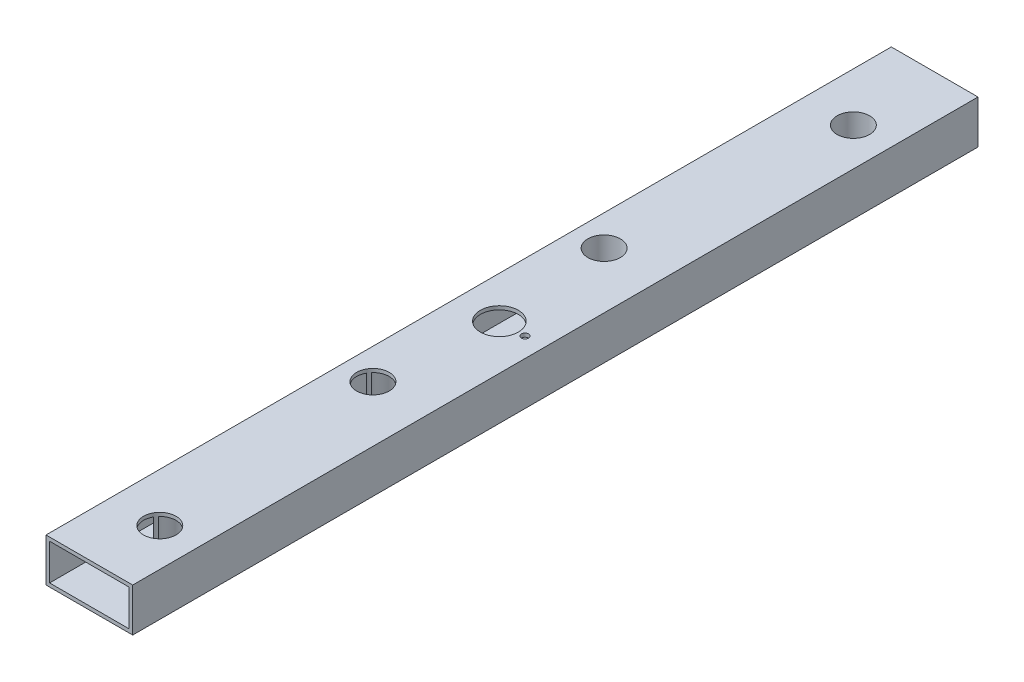
ISO-10303-21;
HEADER;
FILE_DESCRIPTION(('STEP AP214'),'2;1');
FILE_NAME('part.step','',(''),(''),'','','');
FILE_SCHEMA(('AUTOMOTIVE_DESIGN { 1 0 10303 214 1 1 1 1 }'));
ENDSEC;
DATA;
#1=APPLICATION_CONTEXT('core data for automotive mechanical design processes');
#2=APPLICATION_PROTOCOL_DEFINITION('international standard','automotive_design',2000,#1);
#3=PRODUCT_CONTEXT('',#1,'mechanical');
#4=PRODUCT('Part','Part','',(#3));
#5=PRODUCT_RELATED_PRODUCT_CATEGORY('part','',(#4));
#6=PRODUCT_DEFINITION_FORMATION('','',#4);
#7=PRODUCT_DEFINITION_CONTEXT('part definition',#1,'design');
#8=PRODUCT_DEFINITION('design','',#6,#7);
#9=PRODUCT_DEFINITION_SHAPE('','',#8);
#10=(LENGTH_UNIT() NAMED_UNIT(*) SI_UNIT(.MILLI.,.METRE.));
#11=(NAMED_UNIT(*) PLANE_ANGLE_UNIT() SI_UNIT($,.RADIAN.));
#12=(NAMED_UNIT(*) SI_UNIT($,.STERADIAN.) SOLID_ANGLE_UNIT());
#13=UNCERTAINTY_MEASURE_WITH_UNIT(LENGTH_MEASURE(1.E-05),#10,'distance_accuracy_value','');
#14=(GEOMETRIC_REPRESENTATION_CONTEXT(3) GLOBAL_UNCERTAINTY_ASSIGNED_CONTEXT((#13)) GLOBAL_UNIT_ASSIGNED_CONTEXT((#10,
#11,#12)) REPRESENTATION_CONTEXT('',''));
#15=CARTESIAN_POINT('',(0.,0.,0.));
#16=DIRECTION('',(0.,0.,1.));
#17=DIRECTION('',(1.,0.,0.));
#18=AXIS2_PLACEMENT_3D('',#15,#16,#17);
#19=CARTESIAN_POINT('',(59.055,0.,381.));
#20=DIRECTION('',(0.,1.,0.));
#21=DIRECTION('',(0.,0.,1.));
#22=AXIS2_PLACEMENT_3D('',#19,#20,#21);
#23=CYLINDRICAL_SURFACE('',#22,3.17499999999998);
#24=CARTESIAN_POINT('',(59.055,34.925,381.));
#25=DIRECTION('',(0.,1.,0.));
#26=DIRECTION('',(0.,0.,1.));
#27=AXIS2_PLACEMENT_3D('',#24,#25,#26);
#28=CIRCLE('',#27,3.17499999999998);
#29=CARTESIAN_POINT('',(59.055,34.925,384.175));
#30=VERTEX_POINT('',#29);
#31=EDGE_CURVE('E239',#30,#30,#28,.T.);
#32=ORIENTED_EDGE('',*,*,#31,.F.);
#33=EDGE_LOOP('',(#32));
#34=FACE_BOUND('',#33,.T.);
#35=CARTESIAN_POINT('',(59.055,38.1,381.));
#36=DIRECTION('',(0.,1.,0.));
#37=DIRECTION('',(0.,0.,1.));
#38=AXIS2_PLACEMENT_3D('',#35,#36,#37);
#39=CIRCLE('',#38,3.17499999999998);
#40=CARTESIAN_POINT('',(59.055,38.1,384.175));
#41=VERTEX_POINT('',#40);
#42=EDGE_CURVE('E248',#41,#41,#39,.T.);
#43=ORIENTED_EDGE('',*,*,#42,.T.);
#44=EDGE_LOOP('',(#43));
#45=FACE_BOUND('',#44,.T.);
#46=ADVANCED_FACE('F16',(#34,#45),#23,.F.);
#47=CARTESIAN_POINT('',(36.5125,0.,381.));
#48=DIRECTION('',(0.,1.,0.));
#49=DIRECTION('',(0.,0.,1.));
#50=AXIS2_PLACEMENT_3D('',#47,#48,#49);
#51=CYLINDRICAL_SURFACE('',#50,16.66875);
#52=CARTESIAN_POINT('',(36.5125,34.925,381.));
#53=DIRECTION('',(0.,1.,0.));
#54=DIRECTION('',(0.,0.,1.));
#55=AXIS2_PLACEMENT_3D('',#52,#53,#54);
#56=CIRCLE('',#55,16.66875);
#57=CARTESIAN_POINT('',(36.5125,34.925,397.66875));
#58=VERTEX_POINT('',#57);
#59=EDGE_CURVE('E230',#58,#58,#56,.T.);
#60=ORIENTED_EDGE('',*,*,#59,.F.);
#61=EDGE_LOOP('',(#60));
#62=FACE_BOUND('',#61,.T.);
#63=CARTESIAN_POINT('',(36.5125,38.1,381.));
#64=DIRECTION('',(0.,1.,0.));
#65=DIRECTION('',(0.,0.,1.));
#66=AXIS2_PLACEMENT_3D('',#63,#64,#65);
#67=CIRCLE('',#66,16.66875);
#68=CARTESIAN_POINT('',(36.5125,38.1,397.66875));
#69=VERTEX_POINT('',#68);
#70=EDGE_CURVE('E245',#69,#69,#67,.T.);
#71=ORIENTED_EDGE('',*,*,#70,.T.);
#72=EDGE_LOOP('',(#71));
#73=FACE_BOUND('',#72,.T.);
#74=ADVANCED_FACE('F379',(#62,#73),#51,.F.);
#75=CARTESIAN_POINT('',(26.9875,84.3164086658803,279.4));
#76=DIRECTION('',(0.,-1.,0.));
#77=DIRECTION('',(0.,0.,-1.));
#78=AXIS2_PLACEMENT_3D('',#75,#76,#77);
#79=CYLINDRICAL_SURFACE('',#78,17.4625);
#80=CARTESIAN_POINT('',(26.9875,3.175,279.4));
#81=DIRECTION('',(0.,-1.,0.));
#82=DIRECTION('',(0.,0.,-1.));
#83=AXIS2_PLACEMENT_3D('',#80,#81,#82);
#84=CIRCLE('',#83,17.4625);
#85=CARTESIAN_POINT('',(26.9875,3.175,261.9375));
#86=VERTEX_POINT('',#85);
#87=EDGE_CURVE('E223',#86,#86,#84,.T.);
#88=ORIENTED_EDGE('',*,*,#87,.F.);
#89=EDGE_LOOP('',(#88));
#90=FACE_BOUND('',#89,.T.);
#91=CARTESIAN_POINT('',(26.9875,34.925,279.4));
#92=DIRECTION('',(0.,-1.,0.));
#93=DIRECTION('',(0.,0.,-1.));
#94=AXIS2_PLACEMENT_3D('',#91,#92,#93);
#95=CIRCLE('',#94,17.4625);
#96=CARTESIAN_POINT('',(26.9875,34.925,261.9375));
#97=VERTEX_POINT('',#96);
#98=EDGE_CURVE('E242',#97,#97,#95,.F.);
#99=ORIENTED_EDGE('',*,*,#98,.F.);
#100=EDGE_LOOP('',(#99));
#101=FACE_BOUND('',#100,.T.);
#102=ADVANCED_FACE('F376',(#90,#101),#79,.T.);
#103=CARTESIAN_POINT('',(42.8625,84.3164086658803,76.2));
#104=DIRECTION('',(0.,-1.,0.));
#105=DIRECTION('',(0.,0.,-1.));
#106=AXIS2_PLACEMENT_3D('',#103,#104,#105);
#107=CYLINDRICAL_SURFACE('',#106,17.4625);
#108=CARTESIAN_POINT('',(42.8625,3.175,76.2));
#109=DIRECTION('',(0.,-1.,0.));
#110=DIRECTION('',(0.,0.,-1.));
#111=AXIS2_PLACEMENT_3D('',#108,#109,#110);
#112=CIRCLE('',#111,17.4625);
#113=CARTESIAN_POINT('',(42.8625,3.175,58.7375));
#114=VERTEX_POINT('',#113);
#115=EDGE_CURVE('E214',#114,#114,#112,.T.);
#116=ORIENTED_EDGE('',*,*,#115,.F.);
#117=EDGE_LOOP('',(#116));
#118=FACE_BOUND('',#117,.T.);
#119=CARTESIAN_POINT('',(42.8625,34.925,76.2));
#120=DIRECTION('',(0.,-1.,0.));
#121=DIRECTION('',(0.,0.,-1.));
#122=AXIS2_PLACEMENT_3D('',#119,#120,#121);
#123=CIRCLE('',#122,17.4625);
#124=CARTESIAN_POINT('',(42.8625,34.925,58.7375));
#125=VERTEX_POINT('',#124);
#126=EDGE_CURVE('E227',#125,#125,#123,.F.);
#127=ORIENTED_EDGE('',*,*,#126,.F.);
#128=EDGE_LOOP('',(#127));
#129=FACE_BOUND('',#128,.T.);
#130=ADVANCED_FACE('F378',(#118,#129),#107,.T.);
#131=CARTESIAN_POINT('',(3.175,3.175,742.95));
#132=DIRECTION('',(0.,1.,0.));
#133=DIRECTION('',(0.,0.,1.));
#134=AXIS2_PLACEMENT_3D('',#131,#132,#133);
#135=PLANE('',#134);
#136=CARTESIAN_POINT('',(42.8625,3.175,666.75));
#137=DIRECTION('',(0.,-1.,0.));
#138=DIRECTION('',(0.,0.,-1.));
#139=AXIS2_PLACEMENT_3D('',#136,#137,#138);
#140=CIRCLE('',#139,14.2875);
#141=CARTESIAN_POINT('',(53.5117737428428,3.175,676.275));
#142=VERTEX_POINT('',#141);
#143=CARTESIAN_POINT('',(32.2132262571573,3.175,676.275));
#144=VERTEX_POINT('',#143);
#145=EDGE_CURVE('E19',#142,#144,#140,.F.);
#146=ORIENTED_EDGE('',*,*,#145,.T.);
#147=CARTESIAN_POINT('',(42.8625,3.175,685.8));
#148=DIRECTION('',(0.,1.,0.));
#149=DIRECTION('',(0.,0.,1.));
#150=AXIS2_PLACEMENT_3D('',#147,#148,#149);
#151=CIRCLE('',#150,14.2875);
#152=EDGE_CURVE('E131',#144,#142,#151,.F.);
#153=ORIENTED_EDGE('',*,*,#152,.T.);
#154=EDGE_LOOP('',(#146,#153));
#155=FACE_BOUND('',#154,.T.);
#156=ADVANCED_FACE('F130',(#155),#135,.T.);
#157=CARTESIAN_POINT('',(42.8625,84.3164086658803,666.75));
#158=DIRECTION('',(0.,-1.,0.));
#159=DIRECTION('',(0.,0.,-1.));
#160=AXIS2_PLACEMENT_3D('',#157,#158,#159);
#161=CYLINDRICAL_SURFACE('',#160,14.2875);
#162=CARTESIAN_POINT('',(42.8625,34.925,666.75));
#163=DIRECTION('',(0.,-1.,0.));
#164=DIRECTION('',(0.,0.,-1.));
#165=AXIS2_PLACEMENT_3D('',#162,#163,#164);
#166=CIRCLE('',#165,14.2875);
#167=CARTESIAN_POINT('',(32.2132262571573,34.925,676.275));
#168=VERTEX_POINT('',#167);
#169=CARTESIAN_POINT('',(53.5117737428428,34.925,676.275));
#170=VERTEX_POINT('',#169);
#171=EDGE_CURVE('E132',#168,#170,#166,.T.);
#172=ORIENTED_EDGE('',*,*,#171,.F.);
#173=DIRECTION('',(0.,1.,0.));
#174=VECTOR('',#173,1.);
#175=CARTESIAN_POINT('',(32.2132262571573,0.,676.275));
#176=LINE('',#175,#174);
#177=EDGE_CURVE('E137',#168,#144,#176,.F.);
#178=ORIENTED_EDGE('',*,*,#177,.T.);
#179=ORIENTED_EDGE('',*,*,#145,.F.);
#180=DIRECTION('',(0.,1.,0.));
#181=VECTOR('',#180,1.);
#182=CARTESIAN_POINT('',(53.5117737428428,0.,676.275));
#183=LINE('',#182,#181);
#184=EDGE_CURVE('E138',#142,#170,#183,.T.);
#185=ORIENTED_EDGE('',*,*,#184,.T.);
#186=EDGE_LOOP('',(#172,#178,#179,#185));
#187=FACE_BOUND('',#186,.T.);
#188=ADVANCED_FACE('F140',(#187),#161,.F.);
#189=CARTESIAN_POINT('',(3.175,34.925,742.95));
#190=DIRECTION('',(0.,-1.,0.));
#191=DIRECTION('',(0.,0.,-1.));
#192=AXIS2_PLACEMENT_3D('',#189,#190,#191);
#193=PLANE('',#192);
#194=CARTESIAN_POINT('',(42.8625,34.925,685.8));
#195=DIRECTION('',(0.,1.,0.));
#196=DIRECTION('',(0.,0.,1.));
#197=AXIS2_PLACEMENT_3D('',#194,#195,#196);
#198=CIRCLE('',#197,14.2875);
#199=EDGE_CURVE('E209',#170,#168,#198,.T.);
#200=ORIENTED_EDGE('',*,*,#199,.T.);
#201=ORIENTED_EDGE('',*,*,#171,.T.);
#202=EDGE_LOOP('',(#200,#201));
#203=FACE_BOUND('',#202,.T.);
#204=ADVANCED_FACE('F255',(#203),#193,.T.);
#205=CARTESIAN_POINT('',(42.8625,84.3164086658803,666.75));
#206=DIRECTION('',(0.,-1.,0.));
#207=DIRECTION('',(0.,0.,-1.));
#208=AXIS2_PLACEMENT_3D('',#205,#206,#207);
#209=CYLINDRICAL_SURFACE('',#208,17.4625);
#210=DIRECTION('',(0.,1.,0.));
#211=VECTOR('',#210,1.);
#212=CARTESIAN_POINT('',(55.3848688742276,0.,678.920833333333));
#213=LINE('',#212,#211);
#214=CARTESIAN_POINT('',(55.3848688742276,34.925,678.920833333333));
#215=VERTEX_POINT('',#214);
#216=CARTESIAN_POINT('',(55.3848688742276,3.175,678.920833333333));
#217=VERTEX_POINT('',#216);
#218=EDGE_CURVE('E202',#215,#217,#213,.F.);
#219=ORIENTED_EDGE('',*,*,#218,.T.);
#220=CARTESIAN_POINT('',(42.8625,3.175,666.75));
#221=DIRECTION('',(0.,-1.,0.));
#222=DIRECTION('',(0.,0.,-1.));
#223=AXIS2_PLACEMENT_3D('',#220,#221,#222);
#224=CIRCLE('',#223,17.4625);
#225=CARTESIAN_POINT('',(30.3401311257725,3.175,678.920833333333));
#226=VERTEX_POINT('',#225);
#227=EDGE_CURVE('E221',#226,#217,#224,.T.);
#228=ORIENTED_EDGE('',*,*,#227,.F.);
#229=DIRECTION('',(0.,1.,0.));
#230=VECTOR('',#229,1.);
#231=CARTESIAN_POINT('',(30.3401311257725,0.,678.920833333333));
#232=LINE('',#231,#230);
#233=CARTESIAN_POINT('',(30.3401311257725,34.925,678.920833333333));
#234=VERTEX_POINT('',#233);
#235=EDGE_CURVE('E142',#226,#234,#232,.T.);
#236=ORIENTED_EDGE('',*,*,#235,.T.);
#237=CARTESIAN_POINT('',(42.8625,34.925,666.75));
#238=DIRECTION('',(0.,-1.,0.));
#239=DIRECTION('',(0.,0.,-1.));
#240=AXIS2_PLACEMENT_3D('',#237,#238,#239);
#241=CIRCLE('',#240,17.4625);
#242=EDGE_CURVE('E236',#215,#234,#241,.F.);
#243=ORIENTED_EDGE('',*,*,#242,.F.);
#244=EDGE_LOOP('',(#219,#228,#236,#243));
#245=FACE_BOUND('',#244,.T.);
#246=ADVANCED_FACE('F257',(#245),#209,.T.);
#247=CARTESIAN_POINT('',(3.175,3.175,742.95));
#248=DIRECTION('',(0.,1.,0.));
#249=DIRECTION('',(0.,0.,1.));
#250=AXIS2_PLACEMENT_3D('',#247,#248,#249);
#251=PLANE('',#250);
#252=CARTESIAN_POINT('',(26.9875,3.175,463.55));
#253=DIRECTION('',(0.,-1.,0.));
#254=DIRECTION('',(0.,0.,-1.));
#255=AXIS2_PLACEMENT_3D('',#252,#253,#254);
#256=CIRCLE('',#255,14.2875);
#257=CARTESIAN_POINT('',(37.6367737428428,3.175,473.075));
#258=VERTEX_POINT('',#257);
#259=CARTESIAN_POINT('',(16.3382262571573,3.175,473.075));
#260=VERTEX_POINT('',#259);
#261=EDGE_CURVE('E253',#258,#260,#256,.F.);
#262=ORIENTED_EDGE('',*,*,#261,.T.);
#263=CARTESIAN_POINT('',(26.9875,3.175,482.6));
#264=DIRECTION('',(0.,1.,0.));
#265=DIRECTION('',(0.,0.,1.));
#266=AXIS2_PLACEMENT_3D('',#263,#264,#265);
#267=CIRCLE('',#266,14.2875);
#268=EDGE_CURVE('E194',#260,#258,#267,.F.);
#269=ORIENTED_EDGE('',*,*,#268,.T.);
#270=EDGE_LOOP('',(#262,#269));
#271=FACE_BOUND('',#270,.T.);
#272=ADVANCED_FACE('F264',(#271),#251,.T.);
#273=CARTESIAN_POINT('',(26.9875,84.3164086658803,463.55));
#274=DIRECTION('',(0.,-1.,0.));
#275=DIRECTION('',(0.,0.,-1.));
#276=AXIS2_PLACEMENT_3D('',#273,#274,#275);
#277=CYLINDRICAL_SURFACE('',#276,14.2875);
#278=CARTESIAN_POINT('',(26.9875,34.925,463.55));
#279=DIRECTION('',(0.,-1.,0.));
#280=DIRECTION('',(0.,0.,-1.));
#281=AXIS2_PLACEMENT_3D('',#278,#279,#280);
#282=CIRCLE('',#281,14.2875);
#283=CARTESIAN_POINT('',(16.3382262571573,34.925,473.075));
#284=VERTEX_POINT('',#283);
#285=CARTESIAN_POINT('',(37.6367737428428,34.925,473.075));
#286=VERTEX_POINT('',#285);
#287=EDGE_CURVE('E251',#284,#286,#282,.T.);
#288=ORIENTED_EDGE('',*,*,#287,.F.);
#289=DIRECTION('',(0.,1.,0.));
#290=VECTOR('',#289,1.);
#291=CARTESIAN_POINT('',(16.3382262571573,0.,473.075));
#292=LINE('',#291,#290);
#293=EDGE_CURVE('E197',#284,#260,#292,.F.);
#294=ORIENTED_EDGE('',*,*,#293,.T.);
#295=ORIENTED_EDGE('',*,*,#261,.F.);
#296=DIRECTION('',(0.,1.,0.));
#297=VECTOR('',#296,1.);
#298=CARTESIAN_POINT('',(37.6367737428428,0.,473.075));
#299=LINE('',#298,#297);
#300=EDGE_CURVE('E193',#258,#286,#299,.T.);
#301=ORIENTED_EDGE('',*,*,#300,.T.);
#302=EDGE_LOOP('',(#288,#294,#295,#301));
#303=FACE_BOUND('',#302,.T.);
#304=ADVANCED_FACE('F343',(#303),#277,.F.);
#305=CARTESIAN_POINT('',(3.175,34.925,742.95));
#306=DIRECTION('',(0.,-1.,0.));
#307=DIRECTION('',(0.,0.,-1.));
#308=AXIS2_PLACEMENT_3D('',#305,#306,#307);
#309=PLANE('',#308);
#310=CARTESIAN_POINT('',(26.9875,34.925,482.6));
#311=DIRECTION('',(0.,1.,0.));
#312=DIRECTION('',(0.,0.,1.));
#313=AXIS2_PLACEMENT_3D('',#310,#311,#312);
#314=CIRCLE('',#313,14.2875);
#315=EDGE_CURVE('E190',#286,#284,#314,.T.);
#316=ORIENTED_EDGE('',*,*,#315,.T.);
#317=ORIENTED_EDGE('',*,*,#287,.T.);
#318=EDGE_LOOP('',(#316,#317));
#319=FACE_BOUND('',#318,.T.);
#320=ADVANCED_FACE('F339',(#319),#309,.T.);
#321=CARTESIAN_POINT('',(26.9875,84.3164086658803,463.55));
#322=DIRECTION('',(0.,-1.,0.));
#323=DIRECTION('',(0.,0.,-1.));
#324=AXIS2_PLACEMENT_3D('',#321,#322,#323);
#325=CYLINDRICAL_SURFACE('',#324,17.4625);
#326=DIRECTION('',(0.,1.,0.));
#327=VECTOR('',#326,1.);
#328=CARTESIAN_POINT('',(39.5098688742276,0.,475.720833333333));
#329=LINE('',#328,#327);
#330=CARTESIAN_POINT('',(39.5098688742276,34.925,475.720833333333));
#331=VERTEX_POINT('',#330);
#332=CARTESIAN_POINT('',(39.5098688742276,3.175,475.720833333333));
#333=VERTEX_POINT('',#332);
#334=EDGE_CURVE('E183',#331,#333,#329,.F.);
#335=ORIENTED_EDGE('',*,*,#334,.T.);
#336=CARTESIAN_POINT('',(26.9875,3.175,463.55));
#337=DIRECTION('',(0.,-1.,0.));
#338=DIRECTION('',(0.,0.,-1.));
#339=AXIS2_PLACEMENT_3D('',#336,#337,#338);
#340=CIRCLE('',#339,17.4625);
#341=CARTESIAN_POINT('',(14.4651311257725,3.175,475.720833333333));
#342=VERTEX_POINT('',#341);
#343=EDGE_CURVE('E219',#342,#333,#340,.T.);
#344=ORIENTED_EDGE('',*,*,#343,.F.);
#345=DIRECTION('',(0.,1.,0.));
#346=VECTOR('',#345,1.);
#347=CARTESIAN_POINT('',(14.4651311257725,0.,475.720833333333));
#348=LINE('',#347,#346);
#349=CARTESIAN_POINT('',(14.4651311257725,34.925,475.720833333333));
#350=VERTEX_POINT('',#349);
#351=EDGE_CURVE('E201',#342,#350,#348,.T.);
#352=ORIENTED_EDGE('',*,*,#351,.T.);
#353=CARTESIAN_POINT('',(26.9875,34.925,463.55));
#354=DIRECTION('',(0.,-1.,0.));
#355=DIRECTION('',(0.,0.,-1.));
#356=AXIS2_PLACEMENT_3D('',#353,#354,#355);
#357=CIRCLE('',#356,17.4625);
#358=EDGE_CURVE('E233',#331,#350,#357,.F.);
#359=ORIENTED_EDGE('',*,*,#358,.F.);
#360=EDGE_LOOP('',(#335,#344,#352,#359));
#361=FACE_BOUND('',#360,.T.);
#362=ADVANCED_FACE('F335',(#361),#325,.T.);
#363=CARTESIAN_POINT('',(0.,38.1,742.95));
#364=DIRECTION('',(0.,-1.,0.));
#365=DIRECTION('',(0.,0.,-1.));
#366=AXIS2_PLACEMENT_3D('',#363,#364,#365);
#367=PLANE('',#366);
#368=DIRECTION('',(0.,0.,-1.));
#369=VECTOR('',#368,1.);
#370=CARTESIAN_POINT('',(0.,38.1,742.95));
#371=LINE('',#370,#369);
#372=CARTESIAN_POINT('',(0.,38.1,0.));
#373=VERTEX_POINT('',#372);
#374=CARTESIAN_POINT('',(0.,38.1,742.95));
#375=VERTEX_POINT('',#374);
#376=EDGE_CURVE('E173',#373,#375,#371,.F.);
#377=ORIENTED_EDGE('',*,*,#376,.T.);
#378=DIRECTION('',(-1.,0.,0.));
#379=VECTOR('',#378,1.);
#380=CARTESIAN_POINT('',(0.,38.1,742.95));
#381=LINE('',#380,#379);
#382=CARTESIAN_POINT('',(76.2,38.1,742.95));
#383=VERTEX_POINT('',#382);
#384=EDGE_CURVE('E603',#375,#383,#381,.F.);
#385=ORIENTED_EDGE('',*,*,#384,.T.);
#386=DIRECTION('',(0.,0.,1.));
#387=VECTOR('',#386,1.);
#388=CARTESIAN_POINT('',(76.2,38.1,742.95));
#389=LINE('',#388,#387);
#390=CARTESIAN_POINT('',(76.2,38.1,0.));
#391=VERTEX_POINT('',#390);
#392=EDGE_CURVE('E623',#383,#391,#389,.F.);
#393=ORIENTED_EDGE('',*,*,#392,.T.);
#394=DIRECTION('',(-1.,0.,0.));
#395=VECTOR('',#394,1.);
#396=CARTESIAN_POINT('',(0.,38.1,0.));
#397=LINE('',#396,#395);
#398=EDGE_CURVE('E629',#373,#391,#397,.F.);
#399=ORIENTED_EDGE('',*,*,#398,.F.);
#400=EDGE_LOOP('',(#377,#385,#393,#399));
#401=FACE_BOUND('',#400,.T.);
#402=CARTESIAN_POINT('',(42.8625,38.1,76.2));
#403=DIRECTION('',(0.,1.,0.));
#404=DIRECTION('',(0.,0.,1.));
#405=AXIS2_PLACEMENT_3D('',#402,#403,#404);
#406=CIRCLE('',#405,14.2875);
#407=CARTESIAN_POINT('',(42.8625,38.1,90.4875));
#408=VERTEX_POINT('',#407);
#409=EDGE_CURVE('E170',#408,#408,#406,.F.);
#410=ORIENTED_EDGE('',*,*,#409,.T.);
#411=EDGE_LOOP('',(#410));
#412=FACE_BOUND('',#411,.T.);
#413=CARTESIAN_POINT('',(26.9875,38.1,279.4));
#414=DIRECTION('',(0.,1.,0.));
#415=DIRECTION('',(0.,0.,1.));
#416=AXIS2_PLACEMENT_3D('',#413,#414,#415);
#417=CIRCLE('',#416,14.2875);
#418=CARTESIAN_POINT('',(26.9875,38.1,293.6875));
#419=VERTEX_POINT('',#418);
#420=EDGE_CURVE('E174',#419,#419,#417,.F.);
#421=ORIENTED_EDGE('',*,*,#420,.T.);
#422=EDGE_LOOP('',(#421));
#423=FACE_BOUND('',#422,.T.);
#424=ORIENTED_EDGE('',*,*,#70,.F.);
#425=EDGE_LOOP('',(#424));
#426=FACE_BOUND('',#425,.T.);
#427=CARTESIAN_POINT('',(26.9875,38.1,482.6));
#428=DIRECTION('',(0.,1.,0.));
#429=DIRECTION('',(0.,0.,1.));
#430=AXIS2_PLACEMENT_3D('',#427,#428,#429);
#431=CIRCLE('',#430,14.2875);
#432=CARTESIAN_POINT('',(26.9875,38.1,496.8875));
#433=VERTEX_POINT('',#432);
#434=EDGE_CURVE('E187',#433,#433,#431,.F.);
#435=ORIENTED_EDGE('',*,*,#434,.T.);
#436=EDGE_LOOP('',(#435));
#437=FACE_BOUND('',#436,.T.);
#438=CARTESIAN_POINT('',(42.8625,38.1,685.8));
#439=DIRECTION('',(0.,1.,0.));
#440=DIRECTION('',(0.,0.,1.));
#441=AXIS2_PLACEMENT_3D('',#438,#439,#440);
#442=CIRCLE('',#441,14.2875);
#443=CARTESIAN_POINT('',(42.8625,38.1,700.0875));
#444=VERTEX_POINT('',#443);
#445=EDGE_CURVE('E206',#444,#444,#442,.F.);
#446=ORIENTED_EDGE('',*,*,#445,.T.);
#447=EDGE_LOOP('',(#446));
#448=FACE_BOUND('',#447,.T.);
#449=ORIENTED_EDGE('',*,*,#42,.F.);
#450=EDGE_LOOP('',(#449));
#451=FACE_BOUND('',#450,.T.);
#452=ADVANCED_FACE('F331',(#401,#412,#423,#426,#437,#448,#451),#367,.F.);
#453=CARTESIAN_POINT('',(3.175,34.925,742.95));
#454=DIRECTION('',(0.,-1.,0.));
#455=DIRECTION('',(0.,0.,-1.));
#456=AXIS2_PLACEMENT_3D('',#453,#454,#455);
#457=PLANE('',#456);
#458=ORIENTED_EDGE('',*,*,#126,.T.);
#459=EDGE_LOOP('',(#458));
#460=FACE_BOUND('',#459,.T.);
#461=DIRECTION('',(-1.,0.,0.));
#462=VECTOR('',#461,1.);
#463=CARTESIAN_POINT('',(0.,34.925,742.95));
#464=LINE('',#463,#462);
#465=CARTESIAN_POINT('',(73.025,34.925,742.95));
#466=VERTEX_POINT('',#465);
#467=CARTESIAN_POINT('',(3.175,34.925,742.95));
#468=VERTEX_POINT('',#467);
#469=EDGE_CURVE('E614',#466,#468,#464,.T.);
#470=ORIENTED_EDGE('',*,*,#469,.T.);
#471=DIRECTION('',(0.,0.,-1.));
#472=VECTOR('',#471,1.);
#473=CARTESIAN_POINT('',(3.175,34.925,742.95));
#474=LINE('',#473,#472);
#475=CARTESIAN_POINT('',(3.175,34.925,0.));
#476=VERTEX_POINT('',#475);
#477=EDGE_CURVE('E226',#476,#468,#474,.F.);
#478=ORIENTED_EDGE('',*,*,#477,.F.);
#479=DIRECTION('',(-1.,0.,0.));
#480=VECTOR('',#479,1.);
#481=CARTESIAN_POINT('',(0.,34.925,0.));
#482=LINE('',#481,#480);
#483=CARTESIAN_POINT('',(73.025,34.925,0.));
#484=VERTEX_POINT('',#483);
#485=EDGE_CURVE('E632',#484,#476,#482,.T.);
#486=ORIENTED_EDGE('',*,*,#485,.F.);
#487=DIRECTION('',(0.,0.,1.));
#488=VECTOR('',#487,1.);
#489=CARTESIAN_POINT('',(73.025,34.925,742.95));
#490=LINE('',#489,#488);
#491=EDGE_CURVE('E213',#466,#484,#490,.F.);
#492=ORIENTED_EDGE('',*,*,#491,.F.);
#493=EDGE_LOOP('',(#470,#478,#486,#492));
#494=FACE_BOUND('',#493,.T.);
#495=ORIENTED_EDGE('',*,*,#59,.T.);
#496=EDGE_LOOP('',(#495));
#497=FACE_BOUND('',#496,.T.);
#498=ORIENTED_EDGE('',*,*,#358,.T.);
#499=CARTESIAN_POINT('',(26.9875,34.925,482.6));
#500=DIRECTION('',(0.,1.,0.));
#501=DIRECTION('',(0.,0.,1.));
#502=AXIS2_PLACEMENT_3D('',#499,#500,#501);
#503=CIRCLE('',#502,14.2875);
#504=EDGE_CURVE('E184',#350,#331,#503,.T.);
#505=ORIENTED_EDGE('',*,*,#504,.T.);
#506=EDGE_LOOP('',(#498,#505));
#507=FACE_BOUND('',#506,.T.);
#508=ORIENTED_EDGE('',*,*,#242,.T.);
#509=CARTESIAN_POINT('',(42.8625,34.925,685.8));
#510=DIRECTION('',(0.,1.,0.));
#511=DIRECTION('',(0.,0.,1.));
#512=AXIS2_PLACEMENT_3D('',#509,#510,#511);
#513=CIRCLE('',#512,14.2875);
#514=EDGE_CURVE('E203',#234,#215,#513,.T.);
#515=ORIENTED_EDGE('',*,*,#514,.T.);
#516=EDGE_LOOP('',(#508,#515));
#517=FACE_BOUND('',#516,.T.);
#518=ORIENTED_EDGE('',*,*,#31,.T.);
#519=EDGE_LOOP('',(#518));
#520=FACE_BOUND('',#519,.T.);
#521=ORIENTED_EDGE('',*,*,#98,.T.);
#522=EDGE_LOOP('',(#521));
#523=FACE_BOUND('',#522,.T.);
#524=ADVANCED_FACE('F327',(#460,#494,#497,#507,#517,#520,#523),#457,.T.);
#525=CARTESIAN_POINT('',(3.175,3.175,742.95));
#526=DIRECTION('',(1.,0.,0.));
#527=DIRECTION('',(0.,0.,-1.));
#528=AXIS2_PLACEMENT_3D('',#525,#526,#527);
#529=PLANE('',#528);
#530=DIRECTION('',(0.,1.,0.));
#531=VECTOR('',#530,1.);
#532=CARTESIAN_POINT('',(3.175,0.,742.95));
#533=LINE('',#532,#531);
#534=CARTESIAN_POINT('',(3.175,3.175,742.95));
#535=VERTEX_POINT('',#534);
#536=EDGE_CURVE('E617',#468,#535,#533,.F.);
#537=ORIENTED_EDGE('',*,*,#536,.T.);
#538=DIRECTION('',(0.,0.,1.));
#539=VECTOR('',#538,1.);
#540=CARTESIAN_POINT('',(3.175,3.175,742.95));
#541=LINE('',#540,#539);
#542=CARTESIAN_POINT('',(3.175,3.175,0.));
#543=VERTEX_POINT('',#542);
#544=EDGE_CURVE('E218',#543,#535,#541,.T.);
#545=ORIENTED_EDGE('',*,*,#544,.F.);
#546=DIRECTION('',(0.,1.,0.));
#547=VECTOR('',#546,1.);
#548=CARTESIAN_POINT('',(3.175,0.,0.));
#549=LINE('',#548,#547);
#550=EDGE_CURVE('E634',#476,#543,#549,.F.);
#551=ORIENTED_EDGE('',*,*,#550,.F.);
#552=ORIENTED_EDGE('',*,*,#477,.T.);
#553=EDGE_LOOP('',(#537,#545,#551,#552));
#554=FACE_BOUND('',#553,.T.);
#555=ADVANCED_FACE('F323',(#554),#529,.T.);
#556=CARTESIAN_POINT('',(3.175,3.175,742.95));
#557=DIRECTION('',(0.,1.,0.));
#558=DIRECTION('',(0.,0.,1.));
#559=AXIS2_PLACEMENT_3D('',#556,#557,#558);
#560=PLANE('',#559);
#561=ORIENTED_EDGE('',*,*,#115,.T.);
#562=EDGE_LOOP('',(#561));
#563=FACE_BOUND('',#562,.T.);
#564=DIRECTION('',(-1.,0.,0.));
#565=VECTOR('',#564,1.);
#566=CARTESIAN_POINT('',(0.,3.175,742.95));
#567=LINE('',#566,#565);
#568=CARTESIAN_POINT('',(73.025,3.175,742.95));
#569=VERTEX_POINT('',#568);
#570=EDGE_CURVE('E608',#535,#569,#567,.F.);
#571=ORIENTED_EDGE('',*,*,#570,.T.);
#572=DIRECTION('',(0.,0.,1.));
#573=VECTOR('',#572,1.);
#574=CARTESIAN_POINT('',(73.025,3.175,742.95));
#575=LINE('',#574,#573);
#576=CARTESIAN_POINT('',(73.025,3.175,0.));
#577=VERTEX_POINT('',#576);
#578=EDGE_CURVE('E217',#577,#569,#575,.T.);
#579=ORIENTED_EDGE('',*,*,#578,.F.);
#580=DIRECTION('',(-1.,0.,0.));
#581=VECTOR('',#580,1.);
#582=CARTESIAN_POINT('',(0.,3.175,0.));
#583=LINE('',#582,#581);
#584=EDGE_CURVE('E636',#543,#577,#583,.F.);
#585=ORIENTED_EDGE('',*,*,#584,.F.);
#586=ORIENTED_EDGE('',*,*,#544,.T.);
#587=EDGE_LOOP('',(#571,#579,#585,#586));
#588=FACE_BOUND('',#587,.T.);
#589=CARTESIAN_POINT('',(36.5125,3.175,381.));
#590=DIRECTION('',(0.,1.,0.));
#591=DIRECTION('',(0.,0.,1.));
#592=AXIS2_PLACEMENT_3D('',#589,#590,#591);
#593=CIRCLE('',#592,16.66875);
#594=CARTESIAN_POINT('',(36.5125,3.175,397.66875));
#595=VERTEX_POINT('',#594);
#596=EDGE_CURVE('E177',#595,#595,#593,.F.);
#597=ORIENTED_EDGE('',*,*,#596,.T.);
#598=EDGE_LOOP('',(#597));
#599=FACE_BOUND('',#598,.T.);
#600=ORIENTED_EDGE('',*,*,#343,.T.);
#601=CARTESIAN_POINT('',(26.9875,3.175,482.6));
#602=DIRECTION('',(0.,1.,0.));
#603=DIRECTION('',(0.,0.,1.));
#604=AXIS2_PLACEMENT_3D('',#601,#602,#603);
#605=CIRCLE('',#604,14.2875);
#606=EDGE_CURVE('E180',#333,#342,#605,.F.);
#607=ORIENTED_EDGE('',*,*,#606,.T.);
#608=EDGE_LOOP('',(#600,#607));
#609=FACE_BOUND('',#608,.T.);
#610=ORIENTED_EDGE('',*,*,#227,.T.);
#611=CARTESIAN_POINT('',(42.8625,3.175,685.8));
#612=DIRECTION('',(0.,1.,0.));
#613=DIRECTION('',(0.,0.,1.));
#614=AXIS2_PLACEMENT_3D('',#611,#612,#613);
#615=CIRCLE('',#614,14.2875);
#616=EDGE_CURVE('E198',#217,#226,#615,.F.);
#617=ORIENTED_EDGE('',*,*,#616,.T.);
#618=EDGE_LOOP('',(#610,#617));
#619=FACE_BOUND('',#618,.T.);
#620=CARTESIAN_POINT('',(59.055,3.175,381.));
#621=DIRECTION('',(0.,1.,0.));
#622=DIRECTION('',(0.,0.,1.));
#623=AXIS2_PLACEMENT_3D('',#620,#621,#622);
#624=CIRCLE('',#623,3.17499999999998);
#625=CARTESIAN_POINT('',(59.055,3.175,384.175));
#626=VERTEX_POINT('',#625);
#627=EDGE_CURVE('E145',#626,#626,#624,.F.);
#628=ORIENTED_EDGE('',*,*,#627,.T.);
#629=EDGE_LOOP('',(#628));
#630=FACE_BOUND('',#629,.T.);
#631=ORIENTED_EDGE('',*,*,#87,.T.);
#632=EDGE_LOOP('',(#631));
#633=FACE_BOUND('',#632,.T.);
#634=ADVANCED_FACE('F319',(#563,#588,#599,#609,#619,#630,#633),#560,.T.);
#635=CARTESIAN_POINT('',(73.025,3.175,742.95));
#636=DIRECTION('',(-1.,0.,0.));
#637=DIRECTION('',(0.,0.,1.));
#638=AXIS2_PLACEMENT_3D('',#635,#636,#637);
#639=PLANE('',#638);
#640=DIRECTION('',(0.,1.,0.));
#641=VECTOR('',#640,1.);
#642=CARTESIAN_POINT('',(73.025,0.,742.95));
#643=LINE('',#642,#641);
#644=EDGE_CURVE('E611',#569,#466,#643,.T.);
#645=ORIENTED_EDGE('',*,*,#644,.T.);
#646=ORIENTED_EDGE('',*,*,#491,.T.);
#647=DIRECTION('',(0.,1.,0.));
#648=VECTOR('',#647,1.);
#649=CARTESIAN_POINT('',(73.025,0.,0.));
#650=LINE('',#649,#648);
#651=EDGE_CURVE('E169',#577,#484,#650,.T.);
#652=ORIENTED_EDGE('',*,*,#651,.F.);
#653=ORIENTED_EDGE('',*,*,#578,.T.);
#654=EDGE_LOOP('',(#645,#646,#652,#653));
#655=FACE_BOUND('',#654,.T.);
#656=ADVANCED_FACE('F315',(#655),#639,.T.);
#657=CARTESIAN_POINT('',(59.055,0.,381.));
#658=DIRECTION('',(0.,1.,0.));
#659=DIRECTION('',(0.,0.,1.));
#660=AXIS2_PLACEMENT_3D('',#657,#658,#659);
#661=CYLINDRICAL_SURFACE('',#660,3.17499999999998);
#662=CARTESIAN_POINT('',(59.055,0.,381.));
#663=DIRECTION('',(0.,1.,0.));
#664=DIRECTION('',(0.,0.,1.));
#665=AXIS2_PLACEMENT_3D('',#662,#663,#664);
#666=CIRCLE('',#665,3.17499999999998);
#667=CARTESIAN_POINT('',(59.055,0.,384.175));
#668=VERTEX_POINT('',#667);
#669=EDGE_CURVE('E166',#668,#668,#666,.F.);
#670=ORIENTED_EDGE('',*,*,#669,.T.);
#671=EDGE_LOOP('',(#670));
#672=FACE_BOUND('',#671,.T.);
#673=ORIENTED_EDGE('',*,*,#627,.F.);
#674=EDGE_LOOP('',(#673));
#675=FACE_BOUND('',#674,.T.);
#676=ADVANCED_FACE('F311',(#672,#675),#661,.F.);
#677=CARTESIAN_POINT('',(42.8625,0.,685.8));
#678=DIRECTION('',(0.,1.,0.));
#679=DIRECTION('',(0.,0.,1.));
#680=AXIS2_PLACEMENT_3D('',#677,#678,#679);
#681=CYLINDRICAL_SURFACE('',#680,14.2875);
#682=ORIENTED_EDGE('',*,*,#445,.F.);
#683=EDGE_LOOP('',(#682));
#684=FACE_BOUND('',#683,.T.);
#685=ORIENTED_EDGE('',*,*,#514,.F.);
#686=ORIENTED_EDGE('',*,*,#235,.F.);
#687=ORIENTED_EDGE('',*,*,#616,.F.);
#688=ORIENTED_EDGE('',*,*,#218,.F.);
#689=EDGE_LOOP('',(#685,#686,#687,#688));
#690=FACE_BOUND('',#689,.T.);
#691=CARTESIAN_POINT('',(42.8625,0.,685.8));
#692=DIRECTION('',(0.,1.,0.));
#693=DIRECTION('',(0.,0.,1.));
#694=AXIS2_PLACEMENT_3D('',#691,#692,#693);
#695=CIRCLE('',#694,14.2875);
#696=CARTESIAN_POINT('',(42.8625,0.,700.0875));
#697=VERTEX_POINT('',#696);
#698=EDGE_CURVE('E163',#697,#697,#695,.F.);
#699=ORIENTED_EDGE('',*,*,#698,.T.);
#700=EDGE_LOOP('',(#699));
#701=FACE_BOUND('',#700,.T.);
#702=ORIENTED_EDGE('',*,*,#177,.F.);
#703=ORIENTED_EDGE('',*,*,#199,.F.);
#704=ORIENTED_EDGE('',*,*,#184,.F.);
#705=ORIENTED_EDGE('',*,*,#152,.F.);
#706=EDGE_LOOP('',(#702,#703,#704,#705));
#707=FACE_BOUND('',#706,.T.);
#708=ADVANCED_FACE('F135',(#684,#690,#701,#707),#681,.F.);
#709=CARTESIAN_POINT('',(26.9875,0.,482.6));
#710=DIRECTION('',(0.,1.,0.));
#711=DIRECTION('',(0.,0.,1.));
#712=AXIS2_PLACEMENT_3D('',#709,#710,#711);
#713=CYLINDRICAL_SURFACE('',#712,14.2875);
#714=ORIENTED_EDGE('',*,*,#434,.F.);
#715=EDGE_LOOP('',(#714));
#716=FACE_BOUND('',#715,.T.);
#717=ORIENTED_EDGE('',*,*,#504,.F.);
#718=ORIENTED_EDGE('',*,*,#351,.F.);
#719=ORIENTED_EDGE('',*,*,#606,.F.);
#720=ORIENTED_EDGE('',*,*,#334,.F.);
#721=EDGE_LOOP('',(#717,#718,#719,#720));
#722=FACE_BOUND('',#721,.T.);
#723=CARTESIAN_POINT('',(26.9875,0.,482.6));
#724=DIRECTION('',(0.,1.,0.));
#725=DIRECTION('',(0.,0.,1.));
#726=AXIS2_PLACEMENT_3D('',#723,#724,#725);
#727=CIRCLE('',#726,14.2875);
#728=CARTESIAN_POINT('',(26.9875,0.,496.8875));
#729=VERTEX_POINT('',#728);
#730=EDGE_CURVE('E160',#729,#729,#727,.F.);
#731=ORIENTED_EDGE('',*,*,#730,.T.);
#732=EDGE_LOOP('',(#731));
#733=FACE_BOUND('',#732,.T.);
#734=ORIENTED_EDGE('',*,*,#293,.F.);
#735=ORIENTED_EDGE('',*,*,#315,.F.);
#736=ORIENTED_EDGE('',*,*,#300,.F.);
#737=ORIENTED_EDGE('',*,*,#268,.F.);
#738=EDGE_LOOP('',(#734,#735,#736,#737));
#739=FACE_BOUND('',#738,.T.);
#740=ADVANCED_FACE('F304',(#716,#722,#733,#739),#713,.F.);
#741=CARTESIAN_POINT('',(36.5125,0.,381.));
#742=DIRECTION('',(0.,1.,0.));
#743=DIRECTION('',(0.,0.,1.));
#744=AXIS2_PLACEMENT_3D('',#741,#742,#743);
#745=CYLINDRICAL_SURFACE('',#744,16.66875);
#746=CARTESIAN_POINT('',(36.5125,0.,381.));
#747=DIRECTION('',(0.,1.,0.));
#748=DIRECTION('',(0.,0.,1.));
#749=AXIS2_PLACEMENT_3D('',#746,#747,#748);
#750=CIRCLE('',#749,16.66875);
#751=CARTESIAN_POINT('',(36.5125,0.,397.66875));
#752=VERTEX_POINT('',#751);
#753=EDGE_CURVE('E157',#752,#752,#750,.F.);
#754=ORIENTED_EDGE('',*,*,#753,.T.);
#755=EDGE_LOOP('',(#754));
#756=FACE_BOUND('',#755,.T.);
#757=ORIENTED_EDGE('',*,*,#596,.F.);
#758=EDGE_LOOP('',(#757));
#759=FACE_BOUND('',#758,.T.);
#760=ADVANCED_FACE('F300',(#756,#759),#745,.F.);
#761=CARTESIAN_POINT('',(26.9875,0.,279.4));
#762=DIRECTION('',(0.,1.,0.));
#763=DIRECTION('',(0.,0.,1.));
#764=AXIS2_PLACEMENT_3D('',#761,#762,#763);
#765=CYLINDRICAL_SURFACE('',#764,14.2875);
#766=CARTESIAN_POINT('',(26.9875,0.,279.4));
#767=DIRECTION('',(0.,1.,0.));
#768=DIRECTION('',(0.,0.,1.));
#769=AXIS2_PLACEMENT_3D('',#766,#767,#768);
#770=CIRCLE('',#769,14.2875);
#771=CARTESIAN_POINT('',(26.9875,0.,293.6875));
#772=VERTEX_POINT('',#771);
#773=EDGE_CURVE('E154',#772,#772,#770,.F.);
#774=ORIENTED_EDGE('',*,*,#773,.T.);
#775=EDGE_LOOP('',(#774));
#776=FACE_BOUND('',#775,.T.);
#777=ORIENTED_EDGE('',*,*,#420,.F.);
#778=EDGE_LOOP('',(#777));
#779=FACE_BOUND('',#778,.T.);
#780=ADVANCED_FACE('F296',(#776,#779),#765,.F.);
#781=CARTESIAN_POINT('',(42.8625,0.,76.2));
#782=DIRECTION('',(0.,1.,0.));
#783=DIRECTION('',(0.,0.,1.));
#784=AXIS2_PLACEMENT_3D('',#781,#782,#783);
#785=CYLINDRICAL_SURFACE('',#784,14.2875);
#786=CARTESIAN_POINT('',(42.8625,0.,76.2));
#787=DIRECTION('',(0.,1.,0.));
#788=DIRECTION('',(0.,0.,1.));
#789=AXIS2_PLACEMENT_3D('',#786,#787,#788);
#790=CIRCLE('',#789,14.2875);
#791=CARTESIAN_POINT('',(42.8625,0.,90.4875));
#792=VERTEX_POINT('',#791);
#793=EDGE_CURVE('E150',#792,#792,#790,.F.);
#794=ORIENTED_EDGE('',*,*,#793,.T.);
#795=EDGE_LOOP('',(#794));
#796=FACE_BOUND('',#795,.T.);
#797=ORIENTED_EDGE('',*,*,#409,.F.);
#798=EDGE_LOOP('',(#797));
#799=FACE_BOUND('',#798,.T.);
#800=ADVANCED_FACE('F292',(#796,#799),#785,.F.);
#801=CARTESIAN_POINT('',(0.,0.,742.95));
#802=DIRECTION('',(1.,0.,0.));
#803=DIRECTION('',(0.,0.,-1.));
#804=AXIS2_PLACEMENT_3D('',#801,#802,#803);
#805=PLANE('',#804);
#806=DIRECTION('',(0.,0.,1.));
#807=VECTOR('',#806,1.);
#808=CARTESIAN_POINT('',(0.,0.,742.95));
#809=LINE('',#808,#807);
#810=CARTESIAN_POINT('',(0.,0.,0.));
#811=VERTEX_POINT('',#810);
#812=CARTESIAN_POINT('',(0.,0.,742.95));
#813=VERTEX_POINT('',#812);
#814=EDGE_CURVE('E153',#811,#813,#809,.T.);
#815=ORIENTED_EDGE('',*,*,#814,.T.);
#816=DIRECTION('',(0.,1.,0.));
#817=VECTOR('',#816,1.);
#818=CARTESIAN_POINT('',(0.,0.,742.95));
#819=LINE('',#818,#817);
#820=EDGE_CURVE('E605',#813,#375,#819,.T.);
#821=ORIENTED_EDGE('',*,*,#820,.T.);
#822=ORIENTED_EDGE('',*,*,#376,.F.);
#823=DIRECTION('',(0.,1.,0.));
#824=VECTOR('',#823,1.);
#825=CARTESIAN_POINT('',(0.,0.,0.));
#826=LINE('',#825,#824);
#827=EDGE_CURVE('E626',#811,#373,#826,.T.);
#828=ORIENTED_EDGE('',*,*,#827,.F.);
#829=EDGE_LOOP('',(#815,#821,#822,#828));
#830=FACE_BOUND('',#829,.T.);
#831=ADVANCED_FACE('F288',(#830),#805,.F.);
#832=CARTESIAN_POINT('',(0.,0.,742.95));
#833=DIRECTION('',(0.,0.,-1.));
#834=DIRECTION('',(-1.,0.,0.));
#835=AXIS2_PLACEMENT_3D('',#832,#833,#834);
#836=PLANE('',#835);
#837=ORIENTED_EDGE('',*,*,#469,.F.);
#838=ORIENTED_EDGE('',*,*,#644,.F.);
#839=ORIENTED_EDGE('',*,*,#570,.F.);
#840=ORIENTED_EDGE('',*,*,#536,.F.);
#841=EDGE_LOOP('',(#837,#838,#839,#840));
#842=FACE_BOUND('',#841,.T.);
#843=DIRECTION('',(1.,0.,0.));
#844=VECTOR('',#843,1.);
#845=CARTESIAN_POINT('',(0.,0.,742.95));
#846=LINE('',#845,#844);
#847=CARTESIAN_POINT('',(76.2,0.,742.95));
#848=VERTEX_POINT('',#847);
#849=EDGE_CURVE('E642',#813,#848,#846,.T.);
#850=ORIENTED_EDGE('',*,*,#849,.T.);
#851=DIRECTION('',(0.,1.,0.));
#852=VECTOR('',#851,1.);
#853=CARTESIAN_POINT('',(76.2,0.,742.95));
#854=LINE('',#853,#852);
#855=EDGE_CURVE('E620',#848,#383,#854,.T.);
#856=ORIENTED_EDGE('',*,*,#855,.T.);
#857=ORIENTED_EDGE('',*,*,#384,.F.);
#858=ORIENTED_EDGE('',*,*,#820,.F.);
#859=EDGE_LOOP('',(#850,#856,#857,#858));
#860=FACE_BOUND('',#859,.T.);
#861=ADVANCED_FACE('F284',(#842,#860),#836,.F.);
#862=CARTESIAN_POINT('',(76.2,0.,742.95));
#863=DIRECTION('',(-1.,0.,0.));
#864=DIRECTION('',(0.,0.,1.));
#865=AXIS2_PLACEMENT_3D('',#862,#863,#864);
#866=PLANE('',#865);
#867=ORIENTED_EDGE('',*,*,#392,.F.);
#868=ORIENTED_EDGE('',*,*,#855,.F.);
#869=DIRECTION('',(0.,0.,1.));
#870=VECTOR('',#869,1.);
#871=CARTESIAN_POINT('',(76.2,0.,742.95));
#872=LINE('',#871,#870);
#873=CARTESIAN_POINT('',(76.2,0.,0.));
#874=VERTEX_POINT('',#873);
#875=EDGE_CURVE('E25',#848,#874,#872,.F.);
#876=ORIENTED_EDGE('',*,*,#875,.T.);
#877=DIRECTION('',(0.,1.,0.));
#878=VECTOR('',#877,1.);
#879=CARTESIAN_POINT('',(76.2,0.,0.));
#880=LINE('',#879,#878);
#881=EDGE_CURVE('E33',#391,#874,#880,.F.);
#882=ORIENTED_EDGE('',*,*,#881,.F.);
#883=EDGE_LOOP('',(#867,#868,#876,#882));
#884=FACE_BOUND('',#883,.T.);
#885=ADVANCED_FACE('F276',(#884),#866,.F.);
#886=CARTESIAN_POINT('',(0.,0.,0.));
#887=DIRECTION('',(0.,0.,-1.));
#888=DIRECTION('',(-1.,0.,0.));
#889=AXIS2_PLACEMENT_3D('',#886,#887,#888);
#890=PLANE('',#889);
#891=ORIENTED_EDGE('',*,*,#584,.T.);
#892=ORIENTED_EDGE('',*,*,#651,.T.);
#893=ORIENTED_EDGE('',*,*,#485,.T.);
#894=ORIENTED_EDGE('',*,*,#550,.T.);
#895=EDGE_LOOP('',(#891,#892,#893,#894));
#896=FACE_BOUND('',#895,.T.);
#897=ORIENTED_EDGE('',*,*,#881,.T.);
#898=DIRECTION('',(1.,0.,0.));
#899=VECTOR('',#898,1.);
#900=CARTESIAN_POINT('',(0.,0.,0.));
#901=LINE('',#900,#899);
#902=EDGE_CURVE('E11',#874,#811,#901,.F.);
#903=ORIENTED_EDGE('',*,*,#902,.T.);
#904=ORIENTED_EDGE('',*,*,#827,.T.);
#905=ORIENTED_EDGE('',*,*,#398,.T.);
#906=EDGE_LOOP('',(#897,#903,#904,#905));
#907=FACE_BOUND('',#906,.T.);
#908=ADVANCED_FACE('F270',(#896,#907),#890,.T.);
#909=CARTESIAN_POINT('',(0.,0.,742.95));
#910=DIRECTION('',(0.,1.,0.));
#911=DIRECTION('',(0.,0.,1.));
#912=AXIS2_PLACEMENT_3D('',#909,#910,#911);
#913=PLANE('',#912);
#914=ORIENTED_EDGE('',*,*,#875,.F.);
#915=ORIENTED_EDGE('',*,*,#849,.F.);
#916=ORIENTED_EDGE('',*,*,#814,.F.);
#917=ORIENTED_EDGE('',*,*,#902,.F.);
#918=EDGE_LOOP('',(#914,#915,#916,#917));
#919=FACE_BOUND('',#918,.T.);
#920=ORIENTED_EDGE('',*,*,#793,.F.);
#921=EDGE_LOOP('',(#920));
#922=FACE_BOUND('',#921,.T.);
#923=ORIENTED_EDGE('',*,*,#773,.F.);
#924=EDGE_LOOP('',(#923));
#925=FACE_BOUND('',#924,.T.);
#926=ORIENTED_EDGE('',*,*,#753,.F.);
#927=EDGE_LOOP('',(#926));
#928=FACE_BOUND('',#927,.T.);
#929=ORIENTED_EDGE('',*,*,#730,.F.);
#930=EDGE_LOOP('',(#929));
#931=FACE_BOUND('',#930,.T.);
#932=ORIENTED_EDGE('',*,*,#698,.F.);
#933=EDGE_LOOP('',(#932));
#934=FACE_BOUND('',#933,.T.);
#935=ORIENTED_EDGE('',*,*,#669,.F.);
#936=EDGE_LOOP('',(#935));
#937=FACE_BOUND('',#936,.T.);
#938=ADVANCED_FACE('F268',(#919,#922,#925,#928,#931,#934,#937),#913,.F.);
#939=CLOSED_SHELL('',(#46,#74,#102,#130,#156,#188,#204,#246,#272,#304,#320,#362,#452,#524,#555,
#634,#656,#676,#708,#740,#760,#780,#800,#831,#861,#885,#908,#938));
#940=MANIFOLD_SOLID_BREP('B1',#939);
#941=ADVANCED_BREP_SHAPE_REPRESENTATION('',(#18,#940),#14);
#942=SHAPE_DEFINITION_REPRESENTATION(#9,#941);
ENDSEC;
END-ISO-10303-21;
